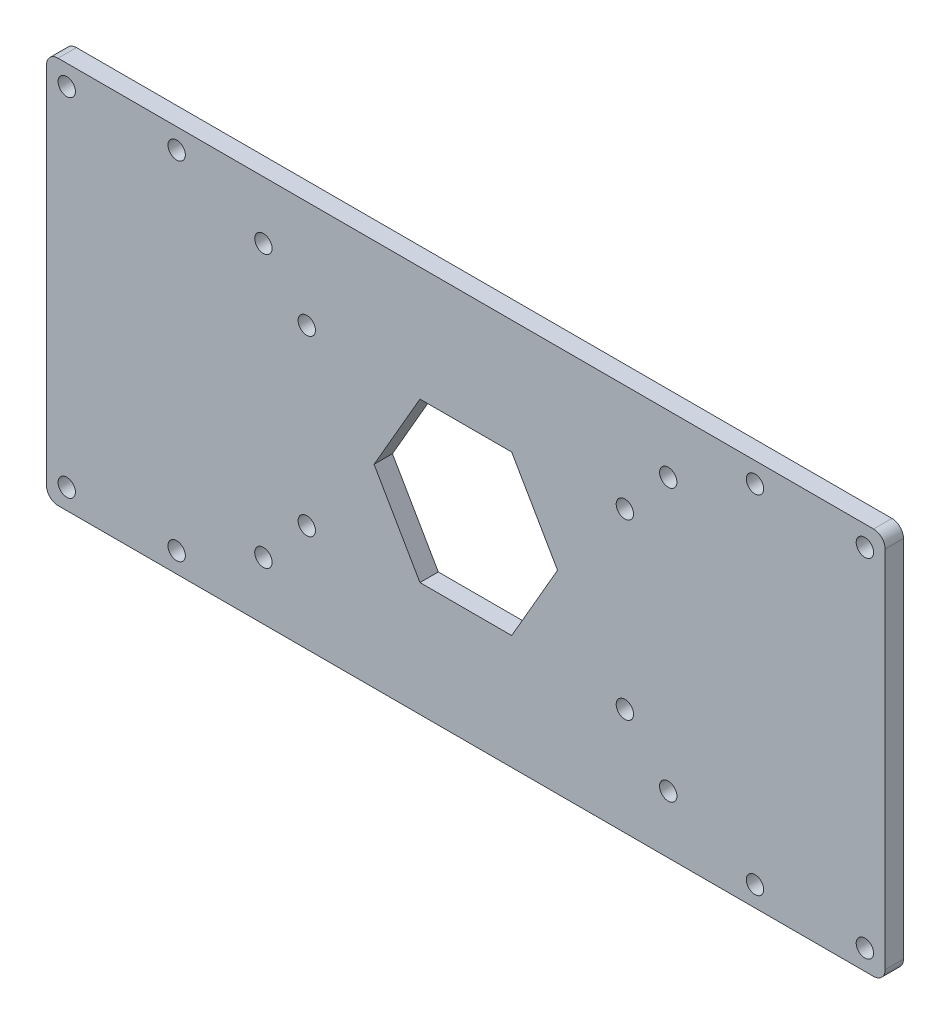
ISO-10303-21;
HEADER;
FILE_DESCRIPTION(('STEP AP214'),'2;1');
FILE_NAME('part.step','',(''),(''),'','','');
FILE_SCHEMA(('AUTOMOTIVE_DESIGN { 1 0 10303 214 1 1 1 1 }'));
ENDSEC;
DATA;
#1=APPLICATION_CONTEXT('core data for automotive mechanical design processes');
#2=APPLICATION_PROTOCOL_DEFINITION('international standard','automotive_design',2000,#1);
#3=PRODUCT_CONTEXT('',#1,'mechanical');
#4=PRODUCT('Part','Part','',(#3));
#5=PRODUCT_RELATED_PRODUCT_CATEGORY('part','',(#4));
#6=PRODUCT_DEFINITION_FORMATION('','',#4);
#7=PRODUCT_DEFINITION_CONTEXT('part definition',#1,'design');
#8=PRODUCT_DEFINITION('design','',#6,#7);
#9=PRODUCT_DEFINITION_SHAPE('','',#8);
#10=(LENGTH_UNIT() NAMED_UNIT(*) SI_UNIT(.MILLI.,.METRE.));
#11=(NAMED_UNIT(*) PLANE_ANGLE_UNIT() SI_UNIT($,.RADIAN.));
#12=(NAMED_UNIT(*) SI_UNIT($,.STERADIAN.) SOLID_ANGLE_UNIT());
#13=UNCERTAINTY_MEASURE_WITH_UNIT(LENGTH_MEASURE(1.E-05),#10,'distance_accuracy_value','');
#14=(GEOMETRIC_REPRESENTATION_CONTEXT(3) GLOBAL_UNCERTAINTY_ASSIGNED_CONTEXT((#13)) GLOBAL_UNIT_ASSIGNED_CONTEXT((#10,
#11,#12)) REPRESENTATION_CONTEXT('',''));
#15=CARTESIAN_POINT('',(0.,0.,0.));
#16=DIRECTION('',(0.,0.,1.));
#17=DIRECTION('',(1.,0.,0.));
#18=AXIS2_PLACEMENT_3D('',#15,#16,#17);
#19=CARTESIAN_POINT('',(0.,0.,3.175));
#20=DIRECTION('',(0.,0.,1.));
#21=DIRECTION('',(1.,0.,0.));
#22=AXIS2_PLACEMENT_3D('',#19,#20,#21);
#23=PLANE('',#22);
#24=CARTESIAN_POINT('',(69.,30.,3.175));
#25=DIRECTION('',(0.,0.,1.));
#26=DIRECTION('',(1.,0.,0.));
#27=AXIS2_PLACEMENT_3D('',#24,#25,#26);
#28=CIRCLE('',#27,1.5);
#29=CARTESIAN_POINT('',(70.5,30.,3.175));
#30=VERTEX_POINT('',#29);
#31=EDGE_CURVE('E192',#30,#30,#28,.T.);
#32=ORIENTED_EDGE('',*,*,#31,.F.);
#33=EDGE_LOOP('',(#32));
#34=FACE_BOUND('',#33,.T.);
#35=CARTESIAN_POINT('',(69.,-30.,3.175));
#36=DIRECTION('',(0.,0.,1.));
#37=DIRECTION('',(1.,0.,0.));
#38=AXIS2_PLACEMENT_3D('',#35,#36,#37);
#39=CIRCLE('',#38,1.5);
#40=CARTESIAN_POINT('',(70.5,-30.,3.175));
#41=VERTEX_POINT('',#40);
#42=EDGE_CURVE('E204',#41,#41,#39,.T.);
#43=ORIENTED_EDGE('',*,*,#42,.F.);
#44=EDGE_LOOP('',(#43));
#45=FACE_BOUND('',#44,.T.);
#46=CARTESIAN_POINT('',(-69.,-30.,3.175));
#47=DIRECTION('',(0.,0.,1.));
#48=DIRECTION('',(1.,0.,0.));
#49=AXIS2_PLACEMENT_3D('',#46,#47,#48);
#50=CIRCLE('',#49,1.5);
#51=CARTESIAN_POINT('',(-67.5,-30.,3.175));
#52=VERTEX_POINT('',#51);
#53=EDGE_CURVE('E216',#52,#52,#50,.T.);
#54=ORIENTED_EDGE('',*,*,#53,.F.);
#55=EDGE_LOOP('',(#54));
#56=FACE_BOUND('',#55,.T.);
#57=CARTESIAN_POINT('',(-50.,30.,3.175));
#58=DIRECTION('',(0.,0.,1.));
#59=DIRECTION('',(1.,0.,0.));
#60=AXIS2_PLACEMENT_3D('',#57,#58,#59);
#61=CIRCLE('',#60,1.5);
#62=CARTESIAN_POINT('',(-48.5,30.,3.175));
#63=VERTEX_POINT('',#62);
#64=EDGE_CURVE('E228',#63,#63,#61,.T.);
#65=ORIENTED_EDGE('',*,*,#64,.F.);
#66=EDGE_LOOP('',(#65));
#67=FACE_BOUND('',#66,.T.);
#68=CARTESIAN_POINT('',(-27.5,-15.,3.175));
#69=DIRECTION('',(0.,0.,1.));
#70=DIRECTION('',(1.,0.,0.));
#71=AXIS2_PLACEMENT_3D('',#68,#69,#70);
#72=CIRCLE('',#71,1.5);
#73=CARTESIAN_POINT('',(-26.,-15.,3.175));
#74=VERTEX_POINT('',#73);
#75=EDGE_CURVE('E240',#74,#74,#72,.T.);
#76=ORIENTED_EDGE('',*,*,#75,.F.);
#77=EDGE_LOOP('',(#76));
#78=FACE_BOUND('',#77,.T.);
#79=CARTESIAN_POINT('',(27.5,15.,3.175));
#80=DIRECTION('',(0.,0.,1.));
#81=DIRECTION('',(1.,0.,0.));
#82=AXIS2_PLACEMENT_3D('',#79,#80,#81);
#83=CIRCLE('',#82,1.5);
#84=CARTESIAN_POINT('',(29.,15.,3.175));
#85=VERTEX_POINT('',#84);
#86=EDGE_CURVE('E252',#85,#85,#83,.T.);
#87=ORIENTED_EDGE('',*,*,#86,.F.);
#88=EDGE_LOOP('',(#87));
#89=FACE_BOUND('',#88,.T.);
#90=CARTESIAN_POINT('',(-35.,-23.5,3.175));
#91=DIRECTION('',(0.,0.,1.));
#92=DIRECTION('',(1.,0.,0.));
#93=AXIS2_PLACEMENT_3D('',#90,#91,#92);
#94=CIRCLE('',#93,1.5);
#95=CARTESIAN_POINT('',(-33.5,-23.5,3.175));
#96=VERTEX_POINT('',#95);
#97=EDGE_CURVE('E264',#96,#96,#94,.T.);
#98=ORIENTED_EDGE('',*,*,#97,.F.);
#99=EDGE_LOOP('',(#98));
#100=FACE_BOUND('',#99,.T.);
#101=CARTESIAN_POINT('',(35.,23.5,3.175));
#102=DIRECTION('',(0.,0.,1.));
#103=DIRECTION('',(1.,0.,0.));
#104=AXIS2_PLACEMENT_3D('',#101,#102,#103);
#105=CIRCLE('',#104,1.5);
#106=CARTESIAN_POINT('',(36.5,23.5,3.175));
#107=VERTEX_POINT('',#106);
#108=EDGE_CURVE('E276',#107,#107,#105,.T.);
#109=ORIENTED_EDGE('',*,*,#108,.F.);
#110=EDGE_LOOP('',(#109));
#111=FACE_BOUND('',#110,.T.);
#112=DIRECTION('',(0.,-1.,0.));
#113=VECTOR('',#112,1.);
#114=CARTESIAN_POINT('',(-72.5,33.5,3.175));
#115=LINE('',#114,#113);
#116=CARTESIAN_POINT('',(-72.5,31.5,3.175));
#117=VERTEX_POINT('',#116);
#118=CARTESIAN_POINT('',(-72.5,-31.5,3.175));
#119=VERTEX_POINT('',#118);
#120=EDGE_CURVE('E288',#117,#119,#115,.T.);
#121=ORIENTED_EDGE('',*,*,#120,.T.);
#122=CARTESIAN_POINT('',(-70.5,-31.5,3.175));
#123=DIRECTION('',(0.,0.,1.));
#124=DIRECTION('',(1.,0.,0.));
#125=AXIS2_PLACEMENT_3D('',#122,#123,#124);
#126=CIRCLE('',#125,2.);
#127=CARTESIAN_POINT('',(-70.5,-33.5,3.175));
#128=VERTEX_POINT('',#127);
#129=EDGE_CURVE('E331',#119,#128,#126,.T.);
#130=ORIENTED_EDGE('',*,*,#129,.T.);
#131=DIRECTION('',(1.,0.,0.));
#132=VECTOR('',#131,1.);
#133=CARTESIAN_POINT('',(-72.5,-33.5,3.175));
#134=LINE('',#133,#132);
#135=CARTESIAN_POINT('',(70.5,-33.5,3.175));
#136=VERTEX_POINT('',#135);
#137=EDGE_CURVE('E291',#128,#136,#134,.T.);
#138=ORIENTED_EDGE('',*,*,#137,.T.);
#139=CARTESIAN_POINT('',(70.5,-31.5,3.175));
#140=DIRECTION('',(0.,0.,1.));
#141=DIRECTION('',(1.,0.,0.));
#142=AXIS2_PLACEMENT_3D('',#139,#140,#141);
#143=CIRCLE('',#142,2.);
#144=CARTESIAN_POINT('',(72.5,-31.5,3.175));
#145=VERTEX_POINT('',#144);
#146=EDGE_CURVE('E329',#136,#145,#143,.T.);
#147=ORIENTED_EDGE('',*,*,#146,.T.);
#148=DIRECTION('',(0.,1.,0.));
#149=VECTOR('',#148,1.);
#150=CARTESIAN_POINT('',(72.5,33.5,3.175));
#151=LINE('',#150,#149);
#152=CARTESIAN_POINT('',(72.5,31.5,3.175));
#153=VERTEX_POINT('',#152);
#154=EDGE_CURVE('E295',#145,#153,#151,.T.);
#155=ORIENTED_EDGE('',*,*,#154,.T.);
#156=CARTESIAN_POINT('',(70.5,31.5,3.175));
#157=DIRECTION('',(0.,0.,1.));
#158=DIRECTION('',(1.,0.,0.));
#159=AXIS2_PLACEMENT_3D('',#156,#157,#158);
#160=CIRCLE('',#159,2.);
#161=CARTESIAN_POINT('',(70.5,33.5,3.175));
#162=VERTEX_POINT('',#161);
#163=EDGE_CURVE('E54',#153,#162,#160,.T.);
#164=ORIENTED_EDGE('',*,*,#163,.T.);
#165=DIRECTION('',(-1.,0.,0.));
#166=VECTOR('',#165,1.);
#167=CARTESIAN_POINT('',(-72.5,33.5,3.175));
#168=LINE('',#167,#166);
#169=CARTESIAN_POINT('',(-70.5,33.5,3.175));
#170=VERTEX_POINT('',#169);
#171=EDGE_CURVE('E297',#162,#170,#168,.T.);
#172=ORIENTED_EDGE('',*,*,#171,.T.);
#173=CARTESIAN_POINT('',(-70.5,31.5,3.175));
#174=DIRECTION('',(0.,0.,1.));
#175=DIRECTION('',(1.,0.,0.));
#176=AXIS2_PLACEMENT_3D('',#173,#174,#175);
#177=CIRCLE('',#176,2.);
#178=EDGE_CURVE('E326',#170,#117,#177,.T.);
#179=ORIENTED_EDGE('',*,*,#178,.T.);
#180=EDGE_LOOP('',(#121,#130,#138,#147,#155,#164,#172,#179));
#181=FACE_BOUND('',#180,.T.);
#182=CARTESIAN_POINT('',(-35.,23.5,3.175));
#183=DIRECTION('',(0.,0.,1.));
#184=DIRECTION('',(1.,0.,0.));
#185=AXIS2_PLACEMENT_3D('',#182,#183,#184);
#186=CIRCLE('',#185,1.5);
#187=CARTESIAN_POINT('',(-33.5,23.5,3.175));
#188=VERTEX_POINT('',#187);
#189=EDGE_CURVE('E282',#188,#188,#186,.T.);
#190=ORIENTED_EDGE('',*,*,#189,.F.);
#191=EDGE_LOOP('',(#190));
#192=FACE_BOUND('',#191,.T.);
#193=CARTESIAN_POINT('',(35.,-23.5,3.175));
#194=DIRECTION('',(0.,0.,1.));
#195=DIRECTION('',(1.,0.,0.));
#196=AXIS2_PLACEMENT_3D('',#193,#194,#195);
#197=CIRCLE('',#196,1.5);
#198=CARTESIAN_POINT('',(36.5,-23.5,3.175));
#199=VERTEX_POINT('',#198);
#200=EDGE_CURVE('E270',#199,#199,#197,.T.);
#201=ORIENTED_EDGE('',*,*,#200,.F.);
#202=EDGE_LOOP('',(#201));
#203=FACE_BOUND('',#202,.T.);
#204=CARTESIAN_POINT('',(-27.5,15.,3.175));
#205=DIRECTION('',(0.,0.,1.));
#206=DIRECTION('',(1.,0.,0.));
#207=AXIS2_PLACEMENT_3D('',#204,#205,#206);
#208=CIRCLE('',#207,1.5);
#209=CARTESIAN_POINT('',(-26.,15.,3.175));
#210=VERTEX_POINT('',#209);
#211=EDGE_CURVE('E258',#210,#210,#208,.T.);
#212=ORIENTED_EDGE('',*,*,#211,.F.);
#213=EDGE_LOOP('',(#212));
#214=FACE_BOUND('',#213,.T.);
#215=CARTESIAN_POINT('',(27.5,-15.,3.175));
#216=DIRECTION('',(0.,0.,1.));
#217=DIRECTION('',(1.,0.,0.));
#218=AXIS2_PLACEMENT_3D('',#215,#216,#217);
#219=CIRCLE('',#218,1.5);
#220=CARTESIAN_POINT('',(29.,-15.,3.175));
#221=VERTEX_POINT('',#220);
#222=EDGE_CURVE('E246',#221,#221,#219,.T.);
#223=ORIENTED_EDGE('',*,*,#222,.F.);
#224=EDGE_LOOP('',(#223));
#225=FACE_BOUND('',#224,.T.);
#226=CARTESIAN_POINT('',(-69.,30.,3.175));
#227=DIRECTION('',(0.,0.,1.));
#228=DIRECTION('',(1.,0.,0.));
#229=AXIS2_PLACEMENT_3D('',#226,#227,#228);
#230=CIRCLE('',#229,1.5);
#231=CARTESIAN_POINT('',(-67.5,30.,3.175));
#232=VERTEX_POINT('',#231);
#233=EDGE_CURVE('E234',#232,#232,#230,.T.);
#234=ORIENTED_EDGE('',*,*,#233,.F.);
#235=EDGE_LOOP('',(#234));
#236=FACE_BOUND('',#235,.T.);
#237=CARTESIAN_POINT('',(-50.,-30.,3.175));
#238=DIRECTION('',(0.,0.,1.));
#239=DIRECTION('',(1.,0.,0.));
#240=AXIS2_PLACEMENT_3D('',#237,#238,#239);
#241=CIRCLE('',#240,1.5);
#242=CARTESIAN_POINT('',(-48.5,-30.,3.175));
#243=VERTEX_POINT('',#242);
#244=EDGE_CURVE('E222',#243,#243,#241,.T.);
#245=ORIENTED_EDGE('',*,*,#244,.F.);
#246=EDGE_LOOP('',(#245));
#247=FACE_BOUND('',#246,.T.);
#248=CARTESIAN_POINT('',(50.,-30.,3.175));
#249=DIRECTION('',(0.,0.,1.));
#250=DIRECTION('',(1.,0.,0.));
#251=AXIS2_PLACEMENT_3D('',#248,#249,#250);
#252=CIRCLE('',#251,1.5);
#253=CARTESIAN_POINT('',(51.5,-30.,3.175));
#254=VERTEX_POINT('',#253);
#255=EDGE_CURVE('E210',#254,#254,#252,.T.);
#256=ORIENTED_EDGE('',*,*,#255,.F.);
#257=EDGE_LOOP('',(#256));
#258=FACE_BOUND('',#257,.T.);
#259=CARTESIAN_POINT('',(50.,30.,3.175));
#260=DIRECTION('',(0.,0.,1.));
#261=DIRECTION('',(1.,0.,0.));
#262=AXIS2_PLACEMENT_3D('',#259,#260,#261);
#263=CIRCLE('',#262,1.5);
#264=CARTESIAN_POINT('',(51.5,30.,3.175));
#265=VERTEX_POINT('',#264);
#266=EDGE_CURVE('E198',#265,#265,#263,.T.);
#267=ORIENTED_EDGE('',*,*,#266,.F.);
#268=EDGE_LOOP('',(#267));
#269=FACE_BOUND('',#268,.T.);
#270=DIRECTION('',(-0.500000000000002,0.866025403784438,0.));
#271=VECTOR('',#270,1.);
#272=CARTESIAN_POINT('',(15.8627197533067,0.,3.175));
#273=LINE('',#272,#271);
#274=CARTESIAN_POINT('',(15.8627197533067,0.,3.175));
#275=VERTEX_POINT('',#274);
#276=CARTESIAN_POINT('',(7.93135987665329,13.7375182794768,3.175));
#277=VERTEX_POINT('',#276);
#278=EDGE_CURVE('E146',#275,#277,#273,.T.);
#279=ORIENTED_EDGE('',*,*,#278,.F.);
#280=DIRECTION('',(0.499999999999994,0.866025403784442,0.));
#281=VECTOR('',#280,1.);
#282=CARTESIAN_POINT('',(7.9313598766535,-13.7375182794767,3.175));
#283=LINE('',#282,#281);
#284=CARTESIAN_POINT('',(7.9313598766535,-13.7375182794767,3.175));
#285=VERTEX_POINT('',#284);
#286=EDGE_CURVE('E136',#285,#275,#283,.T.);
#287=ORIENTED_EDGE('',*,*,#286,.F.);
#288=DIRECTION('',(1.,0.,0.));
#289=VECTOR('',#288,1.);
#290=CARTESIAN_POINT('',(-7.93135987665319,-13.7375182794769,3.175));
#291=LINE('',#290,#289);
#292=CARTESIAN_POINT('',(-7.93135987665319,-13.7375182794769,3.175));
#293=VERTEX_POINT('',#292);
#294=EDGE_CURVE('E168',#293,#285,#291,.T.);
#295=ORIENTED_EDGE('',*,*,#294,.F.);
#296=DIRECTION('',(0.500000000000008,-0.866025403784434,0.));
#297=VECTOR('',#296,1.);
#298=CARTESIAN_POINT('',(-15.8627197533067,-1.24479212741666E-13,3.175));
#299=LINE('',#298,#297);
#300=CARTESIAN_POINT('',(-15.8627197533067,-1.24479212741666E-13,3.175));
#301=VERTEX_POINT('',#300);
#302=EDGE_CURVE('E165',#301,#293,#299,.T.);
#303=ORIENTED_EDGE('',*,*,#302,.F.);
#304=DIRECTION('',(-0.499999999999994,-0.866025403784442,0.));
#305=VECTOR('',#304,1.);
#306=CARTESIAN_POINT('',(-7.93135987665341,13.7375182794767,3.175));
#307=LINE('',#306,#305);
#308=CARTESIAN_POINT('',(-7.93135987665341,13.7375182794767,3.175));
#309=VERTEX_POINT('',#308);
#310=EDGE_CURVE('E161',#309,#301,#307,.T.);
#311=ORIENTED_EDGE('',*,*,#310,.F.);
#312=DIRECTION('',(-1.,0.,0.));
#313=VECTOR('',#312,1.);
#314=CARTESIAN_POINT('',(7.93135987665329,13.7375182794768,3.175));
#315=LINE('',#314,#313);
#316=EDGE_CURVE('E159',#277,#309,#315,.T.);
#317=ORIENTED_EDGE('',*,*,#316,.F.);
#318=EDGE_LOOP('',(#279,#287,#295,#303,#311,#317));
#319=FACE_BOUND('',#318,.T.);
#320=ADVANCED_FACE('F33',(#34,#45,#56,#67,#78,#89,#100,#111,#181,#192,#203,#214,#225,#236,#247,
#258,#269,#319),#23,.T.);
#321=CARTESIAN_POINT('',(0.,0.,0.));
#322=DIRECTION('',(0.,0.,1.));
#323=DIRECTION('',(1.,0.,0.));
#324=AXIS2_PLACEMENT_3D('',#321,#322,#323);
#325=PLANE('',#324);
#326=CARTESIAN_POINT('',(69.,30.,0.));
#327=DIRECTION('',(0.,0.,1.));
#328=DIRECTION('',(1.,0.,0.));
#329=AXIS2_PLACEMENT_3D('',#326,#327,#328);
#330=CIRCLE('',#329,1.5);
#331=CARTESIAN_POINT('',(70.5,30.,0.));
#332=VERTEX_POINT('',#331);
#333=EDGE_CURVE('E154',#332,#332,#330,.T.);
#334=ORIENTED_EDGE('',*,*,#333,.T.);
#335=EDGE_LOOP('',(#334));
#336=FACE_BOUND('',#335,.T.);
#337=CARTESIAN_POINT('',(69.,-30.,0.));
#338=DIRECTION('',(0.,0.,1.));
#339=DIRECTION('',(1.,0.,0.));
#340=AXIS2_PLACEMENT_3D('',#337,#338,#339);
#341=CIRCLE('',#340,1.5);
#342=CARTESIAN_POINT('',(70.5,-30.,0.));
#343=VERTEX_POINT('',#342);
#344=EDGE_CURVE('E201',#343,#343,#341,.T.);
#345=ORIENTED_EDGE('',*,*,#344,.T.);
#346=EDGE_LOOP('',(#345));
#347=FACE_BOUND('',#346,.T.);
#348=CARTESIAN_POINT('',(-69.,-30.,0.));
#349=DIRECTION('',(0.,0.,1.));
#350=DIRECTION('',(1.,0.,0.));
#351=AXIS2_PLACEMENT_3D('',#348,#349,#350);
#352=CIRCLE('',#351,1.5);
#353=CARTESIAN_POINT('',(-67.5,-30.,0.));
#354=VERTEX_POINT('',#353);
#355=EDGE_CURVE('E213',#354,#354,#352,.T.);
#356=ORIENTED_EDGE('',*,*,#355,.T.);
#357=EDGE_LOOP('',(#356));
#358=FACE_BOUND('',#357,.T.);
#359=CARTESIAN_POINT('',(-50.,30.,0.));
#360=DIRECTION('',(0.,0.,1.));
#361=DIRECTION('',(1.,0.,0.));
#362=AXIS2_PLACEMENT_3D('',#359,#360,#361);
#363=CIRCLE('',#362,1.5);
#364=CARTESIAN_POINT('',(-48.5,30.,0.));
#365=VERTEX_POINT('',#364);
#366=EDGE_CURVE('E225',#365,#365,#363,.T.);
#367=ORIENTED_EDGE('',*,*,#366,.T.);
#368=EDGE_LOOP('',(#367));
#369=FACE_BOUND('',#368,.T.);
#370=CARTESIAN_POINT('',(-27.5,-15.,0.));
#371=DIRECTION('',(0.,0.,1.));
#372=DIRECTION('',(1.,0.,0.));
#373=AXIS2_PLACEMENT_3D('',#370,#371,#372);
#374=CIRCLE('',#373,1.5);
#375=CARTESIAN_POINT('',(-26.,-15.,0.));
#376=VERTEX_POINT('',#375);
#377=EDGE_CURVE('E237',#376,#376,#374,.T.);
#378=ORIENTED_EDGE('',*,*,#377,.T.);
#379=EDGE_LOOP('',(#378));
#380=FACE_BOUND('',#379,.T.);
#381=CARTESIAN_POINT('',(27.5,15.,0.));
#382=DIRECTION('',(0.,0.,1.));
#383=DIRECTION('',(1.,0.,0.));
#384=AXIS2_PLACEMENT_3D('',#381,#382,#383);
#385=CIRCLE('',#384,1.5);
#386=CARTESIAN_POINT('',(29.,15.,0.));
#387=VERTEX_POINT('',#386);
#388=EDGE_CURVE('E249',#387,#387,#385,.T.);
#389=ORIENTED_EDGE('',*,*,#388,.T.);
#390=EDGE_LOOP('',(#389));
#391=FACE_BOUND('',#390,.T.);
#392=CARTESIAN_POINT('',(-35.,-23.5,0.));
#393=DIRECTION('',(0.,0.,1.));
#394=DIRECTION('',(1.,0.,0.));
#395=AXIS2_PLACEMENT_3D('',#392,#393,#394);
#396=CIRCLE('',#395,1.5);
#397=CARTESIAN_POINT('',(-33.5,-23.5,0.));
#398=VERTEX_POINT('',#397);
#399=EDGE_CURVE('E261',#398,#398,#396,.T.);
#400=ORIENTED_EDGE('',*,*,#399,.T.);
#401=EDGE_LOOP('',(#400));
#402=FACE_BOUND('',#401,.T.);
#403=CARTESIAN_POINT('',(35.,23.5,0.));
#404=DIRECTION('',(0.,0.,1.));
#405=DIRECTION('',(1.,0.,0.));
#406=AXIS2_PLACEMENT_3D('',#403,#404,#405);
#407=CIRCLE('',#406,1.5);
#408=CARTESIAN_POINT('',(36.5,23.5,0.));
#409=VERTEX_POINT('',#408);
#410=EDGE_CURVE('E273',#409,#409,#407,.T.);
#411=ORIENTED_EDGE('',*,*,#410,.T.);
#412=EDGE_LOOP('',(#411));
#413=FACE_BOUND('',#412,.T.);
#414=DIRECTION('',(1.,0.,0.));
#415=VECTOR('',#414,1.);
#416=CARTESIAN_POINT('',(-72.5,-33.5,0.));
#417=LINE('',#416,#415);
#418=CARTESIAN_POINT('',(-70.5,-33.5,0.));
#419=VERTEX_POINT('',#418);
#420=CARTESIAN_POINT('',(70.5,-33.5,0.));
#421=VERTEX_POINT('',#420);
#422=EDGE_CURVE('E302',#419,#421,#417,.T.);
#423=ORIENTED_EDGE('',*,*,#422,.F.);
#424=CARTESIAN_POINT('',(-70.5,-31.5,0.));
#425=DIRECTION('',(0.,0.,1.));
#426=DIRECTION('',(1.,0.,0.));
#427=AXIS2_PLACEMENT_3D('',#424,#425,#426);
#428=CIRCLE('',#427,2.);
#429=CARTESIAN_POINT('',(-72.5,-31.5,0.));
#430=VERTEX_POINT('',#429);
#431=EDGE_CURVE('E319',#419,#430,#428,.F.);
#432=ORIENTED_EDGE('',*,*,#431,.T.);
#433=DIRECTION('',(0.,-1.,0.));
#434=VECTOR('',#433,1.);
#435=CARTESIAN_POINT('',(-72.5,33.5,0.));
#436=LINE('',#435,#434);
#437=CARTESIAN_POINT('',(-72.5,31.5,0.));
#438=VERTEX_POINT('',#437);
#439=EDGE_CURVE('E285',#438,#430,#436,.T.);
#440=ORIENTED_EDGE('',*,*,#439,.F.);
#441=CARTESIAN_POINT('',(-70.5,31.5,0.));
#442=DIRECTION('',(0.,0.,1.));
#443=DIRECTION('',(1.,0.,0.));
#444=AXIS2_PLACEMENT_3D('',#441,#442,#443);
#445=CIRCLE('',#444,2.);
#446=CARTESIAN_POINT('',(-70.5,33.5,0.));
#447=VERTEX_POINT('',#446);
#448=EDGE_CURVE('E313',#438,#447,#445,.F.);
#449=ORIENTED_EDGE('',*,*,#448,.T.);
#450=DIRECTION('',(-1.,0.,0.));
#451=VECTOR('',#450,1.);
#452=CARTESIAN_POINT('',(-72.5,33.5,0.));
#453=LINE('',#452,#451);
#454=CARTESIAN_POINT('',(70.5,33.5,0.));
#455=VERTEX_POINT('',#454);
#456=EDGE_CURVE('E292',#455,#447,#453,.T.);
#457=ORIENTED_EDGE('',*,*,#456,.F.);
#458=CARTESIAN_POINT('',(70.5,31.5,0.));
#459=DIRECTION('',(0.,0.,1.));
#460=DIRECTION('',(1.,0.,0.));
#461=AXIS2_PLACEMENT_3D('',#458,#459,#460);
#462=CIRCLE('',#461,2.);
#463=CARTESIAN_POINT('',(72.5,31.5,0.));
#464=VERTEX_POINT('',#463);
#465=EDGE_CURVE('E315',#455,#464,#462,.F.);
#466=ORIENTED_EDGE('',*,*,#465,.T.);
#467=DIRECTION('',(0.,1.,0.));
#468=VECTOR('',#467,1.);
#469=CARTESIAN_POINT('',(72.5,33.5,0.));
#470=LINE('',#469,#468);
#471=CARTESIAN_POINT('',(72.5,-31.5,0.));
#472=VERTEX_POINT('',#471);
#473=EDGE_CURVE('E305',#472,#464,#470,.T.);
#474=ORIENTED_EDGE('',*,*,#473,.F.);
#475=CARTESIAN_POINT('',(70.5,-31.5,0.));
#476=DIRECTION('',(0.,0.,1.));
#477=DIRECTION('',(1.,0.,0.));
#478=AXIS2_PLACEMENT_3D('',#475,#476,#477);
#479=CIRCLE('',#478,2.);
#480=EDGE_CURVE('E317',#472,#421,#479,.F.);
#481=ORIENTED_EDGE('',*,*,#480,.T.);
#482=EDGE_LOOP('',(#423,#432,#440,#449,#457,#466,#474,#481));
#483=FACE_BOUND('',#482,.T.);
#484=CARTESIAN_POINT('',(-35.,23.5,0.));
#485=DIRECTION('',(0.,0.,1.));
#486=DIRECTION('',(1.,0.,0.));
#487=AXIS2_PLACEMENT_3D('',#484,#485,#486);
#488=CIRCLE('',#487,1.5);
#489=CARTESIAN_POINT('',(-33.5,23.5,0.));
#490=VERTEX_POINT('',#489);
#491=EDGE_CURVE('E279',#490,#490,#488,.T.);
#492=ORIENTED_EDGE('',*,*,#491,.T.);
#493=EDGE_LOOP('',(#492));
#494=FACE_BOUND('',#493,.T.);
#495=CARTESIAN_POINT('',(35.,-23.5,0.));
#496=DIRECTION('',(0.,0.,1.));
#497=DIRECTION('',(1.,0.,0.));
#498=AXIS2_PLACEMENT_3D('',#495,#496,#497);
#499=CIRCLE('',#498,1.5);
#500=CARTESIAN_POINT('',(36.5,-23.5,0.));
#501=VERTEX_POINT('',#500);
#502=EDGE_CURVE('E267',#501,#501,#499,.T.);
#503=ORIENTED_EDGE('',*,*,#502,.T.);
#504=EDGE_LOOP('',(#503));
#505=FACE_BOUND('',#504,.T.);
#506=CARTESIAN_POINT('',(-27.5,15.,0.));
#507=DIRECTION('',(0.,0.,1.));
#508=DIRECTION('',(1.,0.,0.));
#509=AXIS2_PLACEMENT_3D('',#506,#507,#508);
#510=CIRCLE('',#509,1.5);
#511=CARTESIAN_POINT('',(-26.,15.,0.));
#512=VERTEX_POINT('',#511);
#513=EDGE_CURVE('E255',#512,#512,#510,.T.);
#514=ORIENTED_EDGE('',*,*,#513,.T.);
#515=EDGE_LOOP('',(#514));
#516=FACE_BOUND('',#515,.T.);
#517=CARTESIAN_POINT('',(27.5,-15.,0.));
#518=DIRECTION('',(0.,0.,1.));
#519=DIRECTION('',(1.,0.,0.));
#520=AXIS2_PLACEMENT_3D('',#517,#518,#519);
#521=CIRCLE('',#520,1.5);
#522=CARTESIAN_POINT('',(29.,-15.,0.));
#523=VERTEX_POINT('',#522);
#524=EDGE_CURVE('E243',#523,#523,#521,.T.);
#525=ORIENTED_EDGE('',*,*,#524,.T.);
#526=EDGE_LOOP('',(#525));
#527=FACE_BOUND('',#526,.T.);
#528=CARTESIAN_POINT('',(-69.,30.,0.));
#529=DIRECTION('',(0.,0.,1.));
#530=DIRECTION('',(1.,0.,0.));
#531=AXIS2_PLACEMENT_3D('',#528,#529,#530);
#532=CIRCLE('',#531,1.5);
#533=CARTESIAN_POINT('',(-67.5,30.,0.));
#534=VERTEX_POINT('',#533);
#535=EDGE_CURVE('E231',#534,#534,#532,.T.);
#536=ORIENTED_EDGE('',*,*,#535,.T.);
#537=EDGE_LOOP('',(#536));
#538=FACE_BOUND('',#537,.T.);
#539=CARTESIAN_POINT('',(-50.,-30.,0.));
#540=DIRECTION('',(0.,0.,1.));
#541=DIRECTION('',(1.,0.,0.));
#542=AXIS2_PLACEMENT_3D('',#539,#540,#541);
#543=CIRCLE('',#542,1.5);
#544=CARTESIAN_POINT('',(-48.5,-30.,0.));
#545=VERTEX_POINT('',#544);
#546=EDGE_CURVE('E219',#545,#545,#543,.T.);
#547=ORIENTED_EDGE('',*,*,#546,.T.);
#548=EDGE_LOOP('',(#547));
#549=FACE_BOUND('',#548,.T.);
#550=CARTESIAN_POINT('',(50.,-30.,0.));
#551=DIRECTION('',(0.,0.,1.));
#552=DIRECTION('',(1.,0.,0.));
#553=AXIS2_PLACEMENT_3D('',#550,#551,#552);
#554=CIRCLE('',#553,1.5);
#555=CARTESIAN_POINT('',(51.5,-30.,0.));
#556=VERTEX_POINT('',#555);
#557=EDGE_CURVE('E207',#556,#556,#554,.T.);
#558=ORIENTED_EDGE('',*,*,#557,.T.);
#559=EDGE_LOOP('',(#558));
#560=FACE_BOUND('',#559,.T.);
#561=CARTESIAN_POINT('',(50.,30.,0.));
#562=DIRECTION('',(0.,0.,1.));
#563=DIRECTION('',(1.,0.,0.));
#564=AXIS2_PLACEMENT_3D('',#561,#562,#563);
#565=CIRCLE('',#564,1.5);
#566=CARTESIAN_POINT('',(51.5,30.,0.));
#567=VERTEX_POINT('',#566);
#568=EDGE_CURVE('E195',#567,#567,#565,.T.);
#569=ORIENTED_EDGE('',*,*,#568,.T.);
#570=EDGE_LOOP('',(#569));
#571=FACE_BOUND('',#570,.T.);
#572=DIRECTION('',(0.499999999999994,0.866025403784442,0.));
#573=VECTOR('',#572,1.);
#574=CARTESIAN_POINT('',(7.9313598766535,-13.7375182794767,0.));
#575=LINE('',#574,#573);
#576=CARTESIAN_POINT('',(7.9313598766535,-13.7375182794767,0.));
#577=VERTEX_POINT('',#576);
#578=CARTESIAN_POINT('',(15.8627197533067,0.,0.));
#579=VERTEX_POINT('',#578);
#580=EDGE_CURVE('E170',#577,#579,#575,.T.);
#581=ORIENTED_EDGE('',*,*,#580,.T.);
#582=DIRECTION('',(-0.500000000000002,0.866025403784438,0.));
#583=VECTOR('',#582,1.);
#584=CARTESIAN_POINT('',(15.8627197533067,0.,0.));
#585=LINE('',#584,#583);
#586=CARTESIAN_POINT('',(7.93135987665329,13.7375182794768,0.));
#587=VERTEX_POINT('',#586);
#588=EDGE_CURVE('E153',#579,#587,#585,.T.);
#589=ORIENTED_EDGE('',*,*,#588,.T.);
#590=DIRECTION('',(-1.,0.,0.));
#591=VECTOR('',#590,1.);
#592=CARTESIAN_POINT('',(7.93135987665329,13.7375182794768,0.));
#593=LINE('',#592,#591);
#594=CARTESIAN_POINT('',(-7.93135987665341,13.7375182794767,0.));
#595=VERTEX_POINT('',#594);
#596=EDGE_CURVE('E173',#587,#595,#593,.T.);
#597=ORIENTED_EDGE('',*,*,#596,.T.);
#598=DIRECTION('',(-0.499999999999994,-0.866025403784442,0.));
#599=VECTOR('',#598,1.);
#600=CARTESIAN_POINT('',(-7.93135987665341,13.7375182794767,0.));
#601=LINE('',#600,#599);
#602=CARTESIAN_POINT('',(-15.8627197533067,-1.24479212741666E-13,0.));
#603=VERTEX_POINT('',#602);
#604=EDGE_CURVE('E176',#595,#603,#601,.T.);
#605=ORIENTED_EDGE('',*,*,#604,.T.);
#606=DIRECTION('',(0.500000000000008,-0.866025403784434,0.));
#607=VECTOR('',#606,1.);
#608=CARTESIAN_POINT('',(-15.8627197533067,-1.24479212741666E-13,0.));
#609=LINE('',#608,#607);
#610=CARTESIAN_POINT('',(-7.93135987665319,-13.7375182794769,0.));
#611=VERTEX_POINT('',#610);
#612=EDGE_CURVE('E179',#603,#611,#609,.T.);
#613=ORIENTED_EDGE('',*,*,#612,.T.);
#614=DIRECTION('',(1.,0.,0.));
#615=VECTOR('',#614,1.);
#616=CARTESIAN_POINT('',(-7.93135987665319,-13.7375182794769,0.));
#617=LINE('',#616,#615);
#618=EDGE_CURVE('E147',#611,#577,#617,.T.);
#619=ORIENTED_EDGE('',*,*,#618,.T.);
#620=EDGE_LOOP('',(#581,#589,#597,#605,#613,#619));
#621=FACE_BOUND('',#620,.T.);
#622=ADVANCED_FACE('F347',(#336,#347,#358,#369,#380,#391,#402,#413,#483,#494,#505,#516,#527,
#538,#549,#560,#571,#621),#325,.F.);
#623=CARTESIAN_POINT('',(-72.5,33.5,3.175));
#624=DIRECTION('',(1.,0.,0.));
#625=DIRECTION('',(0.,1.,0.));
#626=AXIS2_PLACEMENT_3D('',#623,#624,#625);
#627=PLANE('',#626);
#628=ORIENTED_EDGE('',*,*,#439,.T.);
#629=DIRECTION('',(0.,0.,-1.));
#630=VECTOR('',#629,1.);
#631=CARTESIAN_POINT('',(-72.5,-31.5,3.175));
#632=LINE('',#631,#630);
#633=EDGE_CURVE('E324',#430,#119,#632,.F.);
#634=ORIENTED_EDGE('',*,*,#633,.T.);
#635=ORIENTED_EDGE('',*,*,#120,.F.);
#636=DIRECTION('',(0.,0.,-1.));
#637=VECTOR('',#636,1.);
#638=CARTESIAN_POINT('',(-72.5,31.5,3.175));
#639=LINE('',#638,#637);
#640=EDGE_CURVE('E321',#117,#438,#639,.T.);
#641=ORIENTED_EDGE('',*,*,#640,.T.);
#642=EDGE_LOOP('',(#628,#634,#635,#641));
#643=FACE_BOUND('',#642,.T.);
#644=ADVANCED_FACE('F361',(#643),#627,.F.);
#645=CARTESIAN_POINT('',(-72.5,-33.5,3.175));
#646=DIRECTION('',(0.,1.,0.));
#647=DIRECTION('',(0.,0.,1.));
#648=AXIS2_PLACEMENT_3D('',#645,#646,#647);
#649=PLANE('',#648);
#650=ORIENTED_EDGE('',*,*,#137,.F.);
#651=DIRECTION('',(0.,0.,-1.));
#652=VECTOR('',#651,1.);
#653=CARTESIAN_POINT('',(-70.5,-33.5,3.175));
#654=LINE('',#653,#652);
#655=EDGE_CURVE('E310',#128,#419,#654,.T.);
#656=ORIENTED_EDGE('',*,*,#655,.T.);
#657=ORIENTED_EDGE('',*,*,#422,.T.);
#658=DIRECTION('',(0.,0.,-1.));
#659=VECTOR('',#658,1.);
#660=CARTESIAN_POINT('',(70.5,-33.5,3.175));
#661=LINE('',#660,#659);
#662=EDGE_CURVE('E299',#421,#136,#661,.F.);
#663=ORIENTED_EDGE('',*,*,#662,.T.);
#664=EDGE_LOOP('',(#650,#656,#657,#663));
#665=FACE_BOUND('',#664,.T.);
#666=ADVANCED_FACE('F369',(#665),#649,.F.);
#667=CARTESIAN_POINT('',(72.5,33.5,3.175));
#668=DIRECTION('',(-1.,0.,0.));
#669=DIRECTION('',(0.,0.,1.));
#670=AXIS2_PLACEMENT_3D('',#667,#668,#669);
#671=PLANE('',#670);
#672=ORIENTED_EDGE('',*,*,#154,.F.);
#673=DIRECTION('',(0.,0.,-1.));
#674=VECTOR('',#673,1.);
#675=CARTESIAN_POINT('',(72.5,-31.5,3.175));
#676=LINE('',#675,#674);
#677=EDGE_CURVE('E335',#145,#472,#676,.T.);
#678=ORIENTED_EDGE('',*,*,#677,.T.);
#679=ORIENTED_EDGE('',*,*,#473,.T.);
#680=DIRECTION('',(0.,0.,-1.));
#681=VECTOR('',#680,1.);
#682=CARTESIAN_POINT('',(72.5,31.5,3.175));
#683=LINE('',#682,#681);
#684=EDGE_CURVE('E333',#464,#153,#683,.F.);
#685=ORIENTED_EDGE('',*,*,#684,.T.);
#686=EDGE_LOOP('',(#672,#678,#679,#685));
#687=FACE_BOUND('',#686,.T.);
#688=ADVANCED_FACE('F341',(#687),#671,.F.);
#689=CARTESIAN_POINT('',(-72.5,33.5,3.175));
#690=DIRECTION('',(0.,-1.,0.));
#691=DIRECTION('',(0.,0.,-1.));
#692=AXIS2_PLACEMENT_3D('',#689,#690,#691);
#693=PLANE('',#692);
#694=ORIENTED_EDGE('',*,*,#171,.F.);
#695=DIRECTION('',(0.,0.,-1.));
#696=VECTOR('',#695,1.);
#697=CARTESIAN_POINT('',(70.5,33.5,3.175));
#698=LINE('',#697,#696);
#699=EDGE_CURVE('E11',#162,#455,#698,.T.);
#700=ORIENTED_EDGE('',*,*,#699,.T.);
#701=ORIENTED_EDGE('',*,*,#456,.T.);
#702=DIRECTION('',(0.,0.,-1.));
#703=VECTOR('',#702,1.);
#704=CARTESIAN_POINT('',(-70.5,33.5,3.175));
#705=LINE('',#704,#703);
#706=EDGE_CURVE('E41',#447,#170,#705,.F.);
#707=ORIENTED_EDGE('',*,*,#706,.T.);
#708=EDGE_LOOP('',(#694,#700,#701,#707));
#709=FACE_BOUND('',#708,.T.);
#710=ADVANCED_FACE('F353',(#709),#693,.F.);
#711=CARTESIAN_POINT('',(-35.,23.5,3.175));
#712=DIRECTION('',(0.,0.,-1.));
#713=DIRECTION('',(-1.,0.,0.));
#714=AXIS2_PLACEMENT_3D('',#711,#712,#713);
#715=CYLINDRICAL_SURFACE('',#714,1.5);
#716=ORIENTED_EDGE('',*,*,#189,.T.);
#717=EDGE_LOOP('',(#716));
#718=FACE_BOUND('',#717,.T.);
#719=ORIENTED_EDGE('',*,*,#491,.F.);
#720=EDGE_LOOP('',(#719));
#721=FACE_BOUND('',#720,.T.);
#722=ADVANCED_FACE('F391',(#718,#721),#715,.F.);
#723=CARTESIAN_POINT('',(35.,23.5,3.175));
#724=DIRECTION('',(0.,0.,-1.));
#725=DIRECTION('',(-1.,0.,0.));
#726=AXIS2_PLACEMENT_3D('',#723,#724,#725);
#727=CYLINDRICAL_SURFACE('',#726,1.5);
#728=ORIENTED_EDGE('',*,*,#108,.T.);
#729=EDGE_LOOP('',(#728));
#730=FACE_BOUND('',#729,.T.);
#731=ORIENTED_EDGE('',*,*,#410,.F.);
#732=EDGE_LOOP('',(#731));
#733=FACE_BOUND('',#732,.T.);
#734=ADVANCED_FACE('F424',(#730,#733),#727,.F.);
#735=CARTESIAN_POINT('',(35.,-23.5,3.175));
#736=DIRECTION('',(0.,0.,-1.));
#737=DIRECTION('',(-1.,0.,0.));
#738=AXIS2_PLACEMENT_3D('',#735,#736,#737);
#739=CYLINDRICAL_SURFACE('',#738,1.5);
#740=ORIENTED_EDGE('',*,*,#200,.T.);
#741=EDGE_LOOP('',(#740));
#742=FACE_BOUND('',#741,.T.);
#743=ORIENTED_EDGE('',*,*,#502,.F.);
#744=EDGE_LOOP('',(#743));
#745=FACE_BOUND('',#744,.T.);
#746=ADVANCED_FACE('F431',(#742,#745),#739,.F.);
#747=CARTESIAN_POINT('',(-35.,-23.5,3.175));
#748=DIRECTION('',(0.,0.,-1.));
#749=DIRECTION('',(-1.,0.,0.));
#750=AXIS2_PLACEMENT_3D('',#747,#748,#749);
#751=CYLINDRICAL_SURFACE('',#750,1.5);
#752=ORIENTED_EDGE('',*,*,#97,.T.);
#753=EDGE_LOOP('',(#752));
#754=FACE_BOUND('',#753,.T.);
#755=ORIENTED_EDGE('',*,*,#399,.F.);
#756=EDGE_LOOP('',(#755));
#757=FACE_BOUND('',#756,.T.);
#758=ADVANCED_FACE('F438',(#754,#757),#751,.F.);
#759=CARTESIAN_POINT('',(-27.5,15.,3.175));
#760=DIRECTION('',(0.,0.,-1.));
#761=DIRECTION('',(-1.,0.,0.));
#762=AXIS2_PLACEMENT_3D('',#759,#760,#761);
#763=CYLINDRICAL_SURFACE('',#762,1.5);
#764=ORIENTED_EDGE('',*,*,#211,.T.);
#765=EDGE_LOOP('',(#764));
#766=FACE_BOUND('',#765,.T.);
#767=ORIENTED_EDGE('',*,*,#513,.F.);
#768=EDGE_LOOP('',(#767));
#769=FACE_BOUND('',#768,.T.);
#770=ADVANCED_FACE('F446',(#766,#769),#763,.F.);
#771=CARTESIAN_POINT('',(27.5,15.,3.175));
#772=DIRECTION('',(0.,0.,-1.));
#773=DIRECTION('',(-1.,0.,0.));
#774=AXIS2_PLACEMENT_3D('',#771,#772,#773);
#775=CYLINDRICAL_SURFACE('',#774,1.5);
#776=ORIENTED_EDGE('',*,*,#86,.T.);
#777=EDGE_LOOP('',(#776));
#778=FACE_BOUND('',#777,.T.);
#779=ORIENTED_EDGE('',*,*,#388,.F.);
#780=EDGE_LOOP('',(#779));
#781=FACE_BOUND('',#780,.T.);
#782=ADVANCED_FACE('F454',(#778,#781),#775,.F.);
#783=CARTESIAN_POINT('',(27.5,-15.,3.175));
#784=DIRECTION('',(0.,0.,-1.));
#785=DIRECTION('',(-1.,0.,0.));
#786=AXIS2_PLACEMENT_3D('',#783,#784,#785);
#787=CYLINDRICAL_SURFACE('',#786,1.5);
#788=ORIENTED_EDGE('',*,*,#222,.T.);
#789=EDGE_LOOP('',(#788));
#790=FACE_BOUND('',#789,.T.);
#791=ORIENTED_EDGE('',*,*,#524,.F.);
#792=EDGE_LOOP('',(#791));
#793=FACE_BOUND('',#792,.T.);
#794=ADVANCED_FACE('F462',(#790,#793),#787,.F.);
#795=CARTESIAN_POINT('',(-27.5,-15.,3.175));
#796=DIRECTION('',(0.,0.,-1.));
#797=DIRECTION('',(-1.,0.,0.));
#798=AXIS2_PLACEMENT_3D('',#795,#796,#797);
#799=CYLINDRICAL_SURFACE('',#798,1.5);
#800=ORIENTED_EDGE('',*,*,#75,.T.);
#801=EDGE_LOOP('',(#800));
#802=FACE_BOUND('',#801,.T.);
#803=ORIENTED_EDGE('',*,*,#377,.F.);
#804=EDGE_LOOP('',(#803));
#805=FACE_BOUND('',#804,.T.);
#806=ADVANCED_FACE('F470',(#802,#805),#799,.F.);
#807=CARTESIAN_POINT('',(-69.,30.,3.175));
#808=DIRECTION('',(0.,0.,-1.));
#809=DIRECTION('',(-1.,0.,0.));
#810=AXIS2_PLACEMENT_3D('',#807,#808,#809);
#811=CYLINDRICAL_SURFACE('',#810,1.5);
#812=ORIENTED_EDGE('',*,*,#233,.T.);
#813=EDGE_LOOP('',(#812));
#814=FACE_BOUND('',#813,.T.);
#815=ORIENTED_EDGE('',*,*,#535,.F.);
#816=EDGE_LOOP('',(#815));
#817=FACE_BOUND('',#816,.T.);
#818=ADVANCED_FACE('F478',(#814,#817),#811,.F.);
#819=CARTESIAN_POINT('',(-50.,30.,3.175));
#820=DIRECTION('',(0.,0.,-1.));
#821=DIRECTION('',(-1.,0.,0.));
#822=AXIS2_PLACEMENT_3D('',#819,#820,#821);
#823=CYLINDRICAL_SURFACE('',#822,1.5);
#824=ORIENTED_EDGE('',*,*,#64,.T.);
#825=EDGE_LOOP('',(#824));
#826=FACE_BOUND('',#825,.T.);
#827=ORIENTED_EDGE('',*,*,#366,.F.);
#828=EDGE_LOOP('',(#827));
#829=FACE_BOUND('',#828,.T.);
#830=ADVANCED_FACE('F486',(#826,#829),#823,.F.);
#831=CARTESIAN_POINT('',(-50.,-30.,3.175));
#832=DIRECTION('',(0.,0.,-1.));
#833=DIRECTION('',(-1.,0.,0.));
#834=AXIS2_PLACEMENT_3D('',#831,#832,#833);
#835=CYLINDRICAL_SURFACE('',#834,1.5);
#836=ORIENTED_EDGE('',*,*,#244,.T.);
#837=EDGE_LOOP('',(#836));
#838=FACE_BOUND('',#837,.T.);
#839=ORIENTED_EDGE('',*,*,#546,.F.);
#840=EDGE_LOOP('',(#839));
#841=FACE_BOUND('',#840,.T.);
#842=ADVANCED_FACE('F494',(#838,#841),#835,.F.);
#843=CARTESIAN_POINT('',(-69.,-30.,3.175));
#844=DIRECTION('',(0.,0.,-1.));
#845=DIRECTION('',(-1.,0.,0.));
#846=AXIS2_PLACEMENT_3D('',#843,#844,#845);
#847=CYLINDRICAL_SURFACE('',#846,1.5);
#848=ORIENTED_EDGE('',*,*,#53,.T.);
#849=EDGE_LOOP('',(#848));
#850=FACE_BOUND('',#849,.T.);
#851=ORIENTED_EDGE('',*,*,#355,.F.);
#852=EDGE_LOOP('',(#851));
#853=FACE_BOUND('',#852,.T.);
#854=ADVANCED_FACE('F502',(#850,#853),#847,.F.);
#855=CARTESIAN_POINT('',(50.,-30.,3.175));
#856=DIRECTION('',(0.,0.,-1.));
#857=DIRECTION('',(-1.,0.,0.));
#858=AXIS2_PLACEMENT_3D('',#855,#856,#857);
#859=CYLINDRICAL_SURFACE('',#858,1.5);
#860=ORIENTED_EDGE('',*,*,#255,.T.);
#861=EDGE_LOOP('',(#860));
#862=FACE_BOUND('',#861,.T.);
#863=ORIENTED_EDGE('',*,*,#557,.F.);
#864=EDGE_LOOP('',(#863));
#865=FACE_BOUND('',#864,.T.);
#866=ADVANCED_FACE('F510',(#862,#865),#859,.F.);
#867=CARTESIAN_POINT('',(69.,-30.,3.175));
#868=DIRECTION('',(0.,0.,-1.));
#869=DIRECTION('',(-1.,0.,0.));
#870=AXIS2_PLACEMENT_3D('',#867,#868,#869);
#871=CYLINDRICAL_SURFACE('',#870,1.5);
#872=ORIENTED_EDGE('',*,*,#42,.T.);
#873=EDGE_LOOP('',(#872));
#874=FACE_BOUND('',#873,.T.);
#875=ORIENTED_EDGE('',*,*,#344,.F.);
#876=EDGE_LOOP('',(#875));
#877=FACE_BOUND('',#876,.T.);
#878=ADVANCED_FACE('F518',(#874,#877),#871,.F.);
#879=CARTESIAN_POINT('',(50.,30.,3.175));
#880=DIRECTION('',(0.,0.,-1.));
#881=DIRECTION('',(-1.,0.,0.));
#882=AXIS2_PLACEMENT_3D('',#879,#880,#881);
#883=CYLINDRICAL_SURFACE('',#882,1.5);
#884=ORIENTED_EDGE('',*,*,#266,.T.);
#885=EDGE_LOOP('',(#884));
#886=FACE_BOUND('',#885,.T.);
#887=ORIENTED_EDGE('',*,*,#568,.F.);
#888=EDGE_LOOP('',(#887));
#889=FACE_BOUND('',#888,.T.);
#890=ADVANCED_FACE('F526',(#886,#889),#883,.F.);
#891=CARTESIAN_POINT('',(69.,30.,3.175));
#892=DIRECTION('',(0.,0.,-1.));
#893=DIRECTION('',(-1.,0.,0.));
#894=AXIS2_PLACEMENT_3D('',#891,#892,#893);
#895=CYLINDRICAL_SURFACE('',#894,1.5);
#896=ORIENTED_EDGE('',*,*,#31,.T.);
#897=EDGE_LOOP('',(#896));
#898=FACE_BOUND('',#897,.T.);
#899=ORIENTED_EDGE('',*,*,#333,.F.);
#900=EDGE_LOOP('',(#899));
#901=FACE_BOUND('',#900,.T.);
#902=ADVANCED_FACE('F534',(#898,#901),#895,.F.);
#903=CARTESIAN_POINT('',(7.9313598766535,-13.7375182794767,3.175));
#904=DIRECTION('',(-0.866025403784442,0.499999999999994,0.));
#905=DIRECTION('',(-0.499999999999994,-0.866025403784442,0.));
#906=AXIS2_PLACEMENT_3D('',#903,#904,#905);
#907=PLANE('',#906);
#908=ORIENTED_EDGE('',*,*,#580,.F.);
#909=DIRECTION('',(0.,0.,-1.));
#910=VECTOR('',#909,1.);
#911=CARTESIAN_POINT('',(7.9313598766535,-13.7375182794767,3.175));
#912=LINE('',#911,#910);
#913=EDGE_CURVE('E142',#285,#577,#912,.T.);
#914=ORIENTED_EDGE('',*,*,#913,.F.);
#915=ORIENTED_EDGE('',*,*,#286,.T.);
#916=DIRECTION('',(0.,0.,-1.));
#917=VECTOR('',#916,1.);
#918=CARTESIAN_POINT('',(15.8627197533067,0.,3.175));
#919=LINE('',#918,#917);
#920=EDGE_CURVE('E139',#275,#579,#919,.T.);
#921=ORIENTED_EDGE('',*,*,#920,.T.);
#922=EDGE_LOOP('',(#908,#914,#915,#921));
#923=FACE_BOUND('',#922,.T.);
#924=ADVANCED_FACE('F138',(#923),#907,.T.);
#925=CARTESIAN_POINT('',(15.8627197533067,0.,3.175));
#926=DIRECTION('',(-0.866025403784438,-0.500000000000002,0.));
#927=DIRECTION('',(0.500000000000002,-0.866025403784438,0.));
#928=AXIS2_PLACEMENT_3D('',#925,#926,#927);
#929=PLANE('',#928);
#930=ORIENTED_EDGE('',*,*,#588,.F.);
#931=ORIENTED_EDGE('',*,*,#920,.F.);
#932=ORIENTED_EDGE('',*,*,#278,.T.);
#933=DIRECTION('',(0.,0.,-1.));
#934=VECTOR('',#933,1.);
#935=CARTESIAN_POINT('',(7.93135987665329,13.7375182794768,3.175));
#936=LINE('',#935,#934);
#937=EDGE_CURVE('E155',#277,#587,#936,.T.);
#938=ORIENTED_EDGE('',*,*,#937,.T.);
#939=EDGE_LOOP('',(#930,#931,#932,#938));
#940=FACE_BOUND('',#939,.T.);
#941=ADVANCED_FACE('F150',(#940),#929,.T.);
#942=CARTESIAN_POINT('',(7.93135987665329,13.7375182794768,3.175));
#943=DIRECTION('',(0.,-1.,0.));
#944=DIRECTION('',(1.,0.,0.));
#945=AXIS2_PLACEMENT_3D('',#942,#943,#944);
#946=PLANE('',#945);
#947=ORIENTED_EDGE('',*,*,#596,.F.);
#948=ORIENTED_EDGE('',*,*,#937,.F.);
#949=ORIENTED_EDGE('',*,*,#316,.T.);
#950=DIRECTION('',(0.,0.,-1.));
#951=VECTOR('',#950,1.);
#952=CARTESIAN_POINT('',(-7.93135987665341,13.7375182794767,3.175));
#953=LINE('',#952,#951);
#954=EDGE_CURVE('E189',#309,#595,#953,.T.);
#955=ORIENTED_EDGE('',*,*,#954,.T.);
#956=EDGE_LOOP('',(#947,#948,#949,#955));
#957=FACE_BOUND('',#956,.T.);
#958=ADVANCED_FACE('F555',(#957),#946,.T.);
#959=CARTESIAN_POINT('',(-7.93135987665341,13.7375182794767,3.175));
#960=DIRECTION('',(0.866025403784442,-0.499999999999994,0.));
#961=DIRECTION('',(0.499999999999994,0.866025403784442,0.));
#962=AXIS2_PLACEMENT_3D('',#959,#960,#961);
#963=PLANE('',#962);
#964=ORIENTED_EDGE('',*,*,#604,.F.);
#965=ORIENTED_EDGE('',*,*,#954,.F.);
#966=ORIENTED_EDGE('',*,*,#310,.T.);
#967=DIRECTION('',(0.,0.,-1.));
#968=VECTOR('',#967,1.);
#969=CARTESIAN_POINT('',(-15.8627197533067,-1.24479212741666E-13,3.175));
#970=LINE('',#969,#968);
#971=EDGE_CURVE('E187',#301,#603,#970,.T.);
#972=ORIENTED_EDGE('',*,*,#971,.T.);
#973=EDGE_LOOP('',(#964,#965,#966,#972));
#974=FACE_BOUND('',#973,.T.);
#975=ADVANCED_FACE('F562',(#974),#963,.T.);
#976=CARTESIAN_POINT('',(-15.8627197533067,-1.24479212741666E-13,3.175));
#977=DIRECTION('',(0.866025403784434,0.500000000000008,0.));
#978=DIRECTION('',(-0.500000000000008,0.866025403784434,0.));
#979=AXIS2_PLACEMENT_3D('',#976,#977,#978);
#980=PLANE('',#979);
#981=ORIENTED_EDGE('',*,*,#612,.F.);
#982=ORIENTED_EDGE('',*,*,#971,.F.);
#983=ORIENTED_EDGE('',*,*,#302,.T.);
#984=DIRECTION('',(0.,0.,-1.));
#985=VECTOR('',#984,1.);
#986=CARTESIAN_POINT('',(-7.93135987665319,-13.7375182794769,3.175));
#987=LINE('',#986,#985);
#988=EDGE_CURVE('E185',#293,#611,#987,.T.);
#989=ORIENTED_EDGE('',*,*,#988,.T.);
#990=EDGE_LOOP('',(#981,#982,#983,#989));
#991=FACE_BOUND('',#990,.T.);
#992=ADVANCED_FACE('F570',(#991),#980,.T.);
#993=CARTESIAN_POINT('',(-7.93135987665319,-13.7375182794769,3.175));
#994=DIRECTION('',(0.,1.,0.));
#995=DIRECTION('',(-1.,0.,0.));
#996=AXIS2_PLACEMENT_3D('',#993,#994,#995);
#997=PLANE('',#996);
#998=ORIENTED_EDGE('',*,*,#618,.F.);
#999=ORIENTED_EDGE('',*,*,#988,.F.);
#1000=ORIENTED_EDGE('',*,*,#294,.T.);
#1001=ORIENTED_EDGE('',*,*,#913,.T.);
#1002=EDGE_LOOP('',(#998,#999,#1000,#1001));
#1003=FACE_BOUND('',#1002,.T.);
#1004=ADVANCED_FACE('F378',(#1003),#997,.T.);
#1005=CARTESIAN_POINT('',(-70.5,-31.5,3.175));
#1006=DIRECTION('',(0.,0.,-1.));
#1007=DIRECTION('',(-1.,0.,0.));
#1008=AXIS2_PLACEMENT_3D('',#1005,#1006,#1007);
#1009=CYLINDRICAL_SURFACE('',#1008,2.);
#1010=ORIENTED_EDGE('',*,*,#129,.F.);
#1011=ORIENTED_EDGE('',*,*,#633,.F.);
#1012=ORIENTED_EDGE('',*,*,#431,.F.);
#1013=ORIENTED_EDGE('',*,*,#655,.F.);
#1014=EDGE_LOOP('',(#1010,#1011,#1012,#1013));
#1015=FACE_BOUND('',#1014,.T.);
#1016=ADVANCED_FACE('F366',(#1015),#1009,.T.);
#1017=CARTESIAN_POINT('',(70.5,-31.5,3.175));
#1018=DIRECTION('',(0.,0.,-1.));
#1019=DIRECTION('',(-1.,0.,0.));
#1020=AXIS2_PLACEMENT_3D('',#1017,#1018,#1019);
#1021=CYLINDRICAL_SURFACE('',#1020,2.);
#1022=ORIENTED_EDGE('',*,*,#146,.F.);
#1023=ORIENTED_EDGE('',*,*,#662,.F.);
#1024=ORIENTED_EDGE('',*,*,#480,.F.);
#1025=ORIENTED_EDGE('',*,*,#677,.F.);
#1026=EDGE_LOOP('',(#1022,#1023,#1024,#1025));
#1027=FACE_BOUND('',#1026,.T.);
#1028=ADVANCED_FACE('F371',(#1027),#1021,.T.);
#1029=CARTESIAN_POINT('',(70.5,31.5,3.175));
#1030=DIRECTION('',(0.,0.,-1.));
#1031=DIRECTION('',(-1.,0.,0.));
#1032=AXIS2_PLACEMENT_3D('',#1029,#1030,#1031);
#1033=CYLINDRICAL_SURFACE('',#1032,2.);
#1034=ORIENTED_EDGE('',*,*,#163,.F.);
#1035=ORIENTED_EDGE('',*,*,#684,.F.);
#1036=ORIENTED_EDGE('',*,*,#465,.F.);
#1037=ORIENTED_EDGE('',*,*,#699,.F.);
#1038=EDGE_LOOP('',(#1034,#1035,#1036,#1037));
#1039=FACE_BOUND('',#1038,.T.);
#1040=ADVANCED_FACE('F352',(#1039),#1033,.T.);
#1041=CARTESIAN_POINT('',(-70.5,31.5,3.175));
#1042=DIRECTION('',(0.,0.,-1.));
#1043=DIRECTION('',(-1.,0.,0.));
#1044=AXIS2_PLACEMENT_3D('',#1041,#1042,#1043);
#1045=CYLINDRICAL_SURFACE('',#1044,2.);
#1046=ORIENTED_EDGE('',*,*,#178,.F.);
#1047=ORIENTED_EDGE('',*,*,#706,.F.);
#1048=ORIENTED_EDGE('',*,*,#448,.F.);
#1049=ORIENTED_EDGE('',*,*,#640,.F.);
#1050=EDGE_LOOP('',(#1046,#1047,#1048,#1049));
#1051=FACE_BOUND('',#1050,.T.);
#1052=ADVANCED_FACE('F35',(#1051),#1045,.T.);
#1053=CLOSED_SHELL('',(#320,#622,#644,#666,#688,#710,#722,#734,#746,#758,#770,#782,#794,#806,
#818,#830,#842,#854,#866,#878,#890,#902,#924,#941,#958,#975,#992,#1004,#1016,#1028,#1040,#1052));
#1054=MANIFOLD_SOLID_BREP('B2',#1053);
#1055=ADVANCED_BREP_SHAPE_REPRESENTATION('',(#18,#1054),#14);
#1056=SHAPE_DEFINITION_REPRESENTATION(#9,#1055);
ENDSEC;
END-ISO-10303-21;
